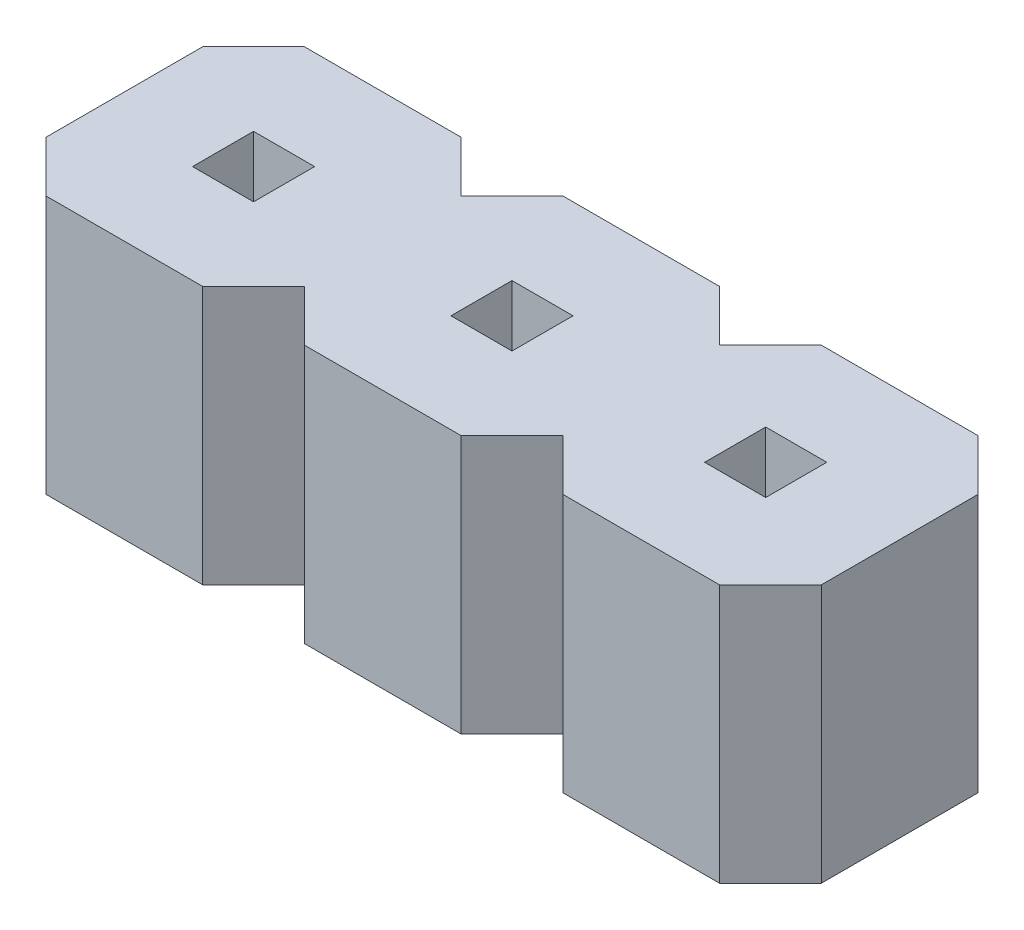
ISO-10303-21;
HEADER;
FILE_DESCRIPTION(('STEP AP214'),'2;1');
FILE_NAME('part.step','',(''),(''),'','','');
FILE_SCHEMA(('AUTOMOTIVE_DESIGN { 1 0 10303 214 1 1 1 1 }'));
ENDSEC;
DATA;
#1=APPLICATION_CONTEXT('core data for automotive mechanical design processes');
#2=APPLICATION_PROTOCOL_DEFINITION('international standard','automotive_design',2000,#1);
#3=PRODUCT_CONTEXT('',#1,'mechanical');
#4=PRODUCT('Part','Part','',(#3));
#5=PRODUCT_RELATED_PRODUCT_CATEGORY('part','',(#4));
#6=PRODUCT_DEFINITION_FORMATION('','',#4);
#7=PRODUCT_DEFINITION_CONTEXT('part definition',#1,'design');
#8=PRODUCT_DEFINITION('design','',#6,#7);
#9=PRODUCT_DEFINITION_SHAPE('','',#8);
#10=(LENGTH_UNIT() NAMED_UNIT(*) SI_UNIT(.MILLI.,.METRE.));
#11=(NAMED_UNIT(*) PLANE_ANGLE_UNIT() SI_UNIT($,.RADIAN.));
#12=(NAMED_UNIT(*) SI_UNIT($,.STERADIAN.) SOLID_ANGLE_UNIT());
#13=UNCERTAINTY_MEASURE_WITH_UNIT(LENGTH_MEASURE(1.E-05),#10,'distance_accuracy_value','');
#14=(GEOMETRIC_REPRESENTATION_CONTEXT(3) GLOBAL_UNCERTAINTY_ASSIGNED_CONTEXT((#13)) GLOBAL_UNIT_ASSIGNED_CONTEXT((#10,
#11,#12)) REPRESENTATION_CONTEXT('',''));
#15=CARTESIAN_POINT('',(0.,0.,0.));
#16=DIRECTION('',(0.,0.,1.));
#17=DIRECTION('',(1.,0.,0.));
#18=AXIS2_PLACEMENT_3D('',#15,#16,#17);
#19=CARTESIAN_POINT('',(0.,2.54,0.));
#20=DIRECTION('',(0.,-1.,0.));
#21=DIRECTION('',(0.,0.,-1.));
#22=AXIS2_PLACEMENT_3D('',#19,#20,#21);
#23=PLANE('',#22);
#24=DIRECTION('',(0.,0.,-1.));
#25=VECTOR('',#24,1.);
#26=CARTESIAN_POINT('',(-0.97,2.54,-0.97));
#27=LINE('',#26,#25);
#28=CARTESIAN_POINT('',(-0.97,2.54,-0.97));
#29=VERTEX_POINT('',#28);
#30=CARTESIAN_POINT('',(-0.97,2.54,-1.57));
#31=VERTEX_POINT('',#30);
#32=EDGE_CURVE('E280',#29,#31,#27,.T.);
#33=ORIENTED_EDGE('',*,*,#32,.F.);
#34=DIRECTION('',(1.,0.,0.));
#35=VECTOR('',#34,1.);
#36=CARTESIAN_POINT('',(-1.57,2.54,-0.97));
#37=LINE('',#36,#35);
#38=CARTESIAN_POINT('',(-1.57,2.54,-0.97));
#39=VERTEX_POINT('',#38);
#40=EDGE_CURVE('E288',#39,#29,#37,.T.);
#41=ORIENTED_EDGE('',*,*,#40,.F.);
#42=DIRECTION('',(0.,0.,1.));
#43=VECTOR('',#42,1.);
#44=CARTESIAN_POINT('',(-1.57,2.54,-0.97));
#45=LINE('',#44,#43);
#46=CARTESIAN_POINT('',(-1.57,2.54,-1.57));
#47=VERTEX_POINT('',#46);
#48=EDGE_CURVE('E285',#47,#39,#45,.T.);
#49=ORIENTED_EDGE('',*,*,#48,.F.);
#50=DIRECTION('',(-1.,0.,0.));
#51=VECTOR('',#50,1.);
#52=CARTESIAN_POINT('',(-1.57,2.54,-1.57));
#53=LINE('',#52,#51);
#54=EDGE_CURVE('E282',#31,#47,#53,.T.);
#55=ORIENTED_EDGE('',*,*,#54,.F.);
#56=EDGE_LOOP('',(#33,#41,#49,#55));
#57=FACE_BOUND('',#56,.T.);
#58=DIRECTION('',(-1.,0.,0.));
#59=VECTOR('',#58,1.);
#60=CARTESIAN_POINT('',(-3.04,2.54,-2.54));
#61=LINE('',#60,#59);
#62=CARTESIAN_POINT('',(-3.04,2.54,-2.54));
#63=VERTEX_POINT('',#62);
#64=CARTESIAN_POINT('',(-4.58,2.54,-2.54));
#65=VERTEX_POINT('',#64);
#66=EDGE_CURVE('E342',#63,#65,#61,.T.);
#67=ORIENTED_EDGE('',*,*,#66,.T.);
#68=DIRECTION('',(-0.707106781186548,0.,0.707106781186548));
#69=VECTOR('',#68,1.);
#70=CARTESIAN_POINT('',(-4.58,2.54,-2.54));
#71=LINE('',#70,#69);
#72=CARTESIAN_POINT('',(-5.08,2.54,-2.04));
#73=VERTEX_POINT('',#72);
#74=EDGE_CURVE('E345',#65,#73,#71,.T.);
#75=ORIENTED_EDGE('',*,*,#74,.T.);
#76=DIRECTION('',(0.,0.,1.));
#77=VECTOR('',#76,1.);
#78=CARTESIAN_POINT('',(-5.08,2.54,-0.499999999999999));
#79=LINE('',#78,#77);
#80=CARTESIAN_POINT('',(-5.08,2.54,-0.499999999999999));
#81=VERTEX_POINT('',#80);
#82=EDGE_CURVE('E348',#73,#81,#79,.T.);
#83=ORIENTED_EDGE('',*,*,#82,.T.);
#84=DIRECTION('',(0.707106781186547,0.,0.707106781186548));
#85=VECTOR('',#84,1.);
#86=CARTESIAN_POINT('',(-4.58,2.54,0.));
#87=LINE('',#86,#85);
#88=CARTESIAN_POINT('',(-4.58,2.54,0.));
#89=VERTEX_POINT('',#88);
#90=EDGE_CURVE('E350',#81,#89,#87,.T.);
#91=ORIENTED_EDGE('',*,*,#90,.T.);
#92=DIRECTION('',(1.,0.,0.));
#93=VECTOR('',#92,1.);
#94=CARTESIAN_POINT('',(-3.04,2.54,0.));
#95=LINE('',#94,#93);
#96=CARTESIAN_POINT('',(-3.04,2.54,0.));
#97=VERTEX_POINT('',#96);
#98=EDGE_CURVE('E352',#89,#97,#95,.T.);
#99=ORIENTED_EDGE('',*,*,#98,.T.);
#100=DIRECTION('',(0.707106781186548,0.,-0.707106781186547));
#101=VECTOR('',#100,1.);
#102=CARTESIAN_POINT('',(-3.04,2.54,0.));
#103=LINE('',#102,#101);
#104=CARTESIAN_POINT('',(-2.54,2.54,-0.499999999999999));
#105=VERTEX_POINT('',#104);
#106=EDGE_CURVE('E354',#97,#105,#103,.T.);
#107=ORIENTED_EDGE('',*,*,#106,.T.);
#108=DIRECTION('',(0.707106781186548,0.,0.707106781186547));
#109=VECTOR('',#108,1.);
#110=CARTESIAN_POINT('',(-2.54,2.54,-0.499999999999999));
#111=LINE('',#110,#109);
#112=CARTESIAN_POINT('',(-2.04,2.54,0.));
#113=VERTEX_POINT('',#112);
#114=EDGE_CURVE('E356',#105,#113,#111,.T.);
#115=ORIENTED_EDGE('',*,*,#114,.T.);
#116=DIRECTION('',(1.,0.,0.));
#117=VECTOR('',#116,1.);
#118=CARTESIAN_POINT('',(-0.5,2.54,0.));
#119=LINE('',#118,#117);
#120=CARTESIAN_POINT('',(-0.5,2.54,0.));
#121=VERTEX_POINT('',#120);
#122=EDGE_CURVE('E358',#113,#121,#119,.T.);
#123=ORIENTED_EDGE('',*,*,#122,.T.);
#124=DIRECTION('',(0.707106781186547,0.,-0.707106781186548));
#125=VECTOR('',#124,1.);
#126=CARTESIAN_POINT('',(0.,2.54,-0.5));
#127=LINE('',#126,#125);
#128=CARTESIAN_POINT('',(0.,2.54,-0.5));
#129=VERTEX_POINT('',#128);
#130=EDGE_CURVE('E360',#121,#129,#127,.T.);
#131=ORIENTED_EDGE('',*,*,#130,.T.);
#132=DIRECTION('',(0.707106781186546,0.,0.707106781186549));
#133=VECTOR('',#132,1.);
#134=CARTESIAN_POINT('',(0.499999999999998,2.54,0.));
#135=LINE('',#134,#133);
#136=CARTESIAN_POINT('',(0.499999999999998,2.54,0.));
#137=VERTEX_POINT('',#136);
#138=EDGE_CURVE('E362',#129,#137,#135,.T.);
#139=ORIENTED_EDGE('',*,*,#138,.T.);
#140=DIRECTION('',(1.,0.,0.));
#141=VECTOR('',#140,1.);
#142=CARTESIAN_POINT('',(2.04,2.54,0.));
#143=LINE('',#142,#141);
#144=CARTESIAN_POINT('',(2.04,2.54,0.));
#145=VERTEX_POINT('',#144);
#146=EDGE_CURVE('E364',#137,#145,#143,.T.);
#147=ORIENTED_EDGE('',*,*,#146,.T.);
#148=DIRECTION('',(0.707106781186548,0.,-0.707106781186547));
#149=VECTOR('',#148,1.);
#150=CARTESIAN_POINT('',(2.54,2.54,-0.499999999999999));
#151=LINE('',#150,#149);
#152=CARTESIAN_POINT('',(2.54,2.54,-0.499999999999999));
#153=VERTEX_POINT('',#152);
#154=EDGE_CURVE('E366',#145,#153,#151,.T.);
#155=ORIENTED_EDGE('',*,*,#154,.T.);
#156=DIRECTION('',(0.,0.,-1.));
#157=VECTOR('',#156,1.);
#158=CARTESIAN_POINT('',(2.54,2.54,-2.03999999999999));
#159=LINE('',#158,#157);
#160=CARTESIAN_POINT('',(2.54,2.54,-2.03999999999999));
#161=VERTEX_POINT('',#160);
#162=EDGE_CURVE('E368',#153,#161,#159,.T.);
#163=ORIENTED_EDGE('',*,*,#162,.T.);
#164=DIRECTION('',(-0.707106781186546,0.,-0.707106781186549));
#165=VECTOR('',#164,1.);
#166=CARTESIAN_POINT('',(2.04,2.54,-2.54));
#167=LINE('',#166,#165);
#168=CARTESIAN_POINT('',(2.04,2.54,-2.54));
#169=VERTEX_POINT('',#168);
#170=EDGE_CURVE('E370',#161,#169,#167,.T.);
#171=ORIENTED_EDGE('',*,*,#170,.T.);
#172=DIRECTION('',(-1.,0.,0.));
#173=VECTOR('',#172,1.);
#174=CARTESIAN_POINT('',(0.5,2.54,-2.54));
#175=LINE('',#174,#173);
#176=CARTESIAN_POINT('',(0.5,2.54,-2.54));
#177=VERTEX_POINT('',#176);
#178=EDGE_CURVE('E372',#169,#177,#175,.T.);
#179=ORIENTED_EDGE('',*,*,#178,.T.);
#180=DIRECTION('',(-0.707106781186549,0.,0.707106781186546));
#181=VECTOR('',#180,1.);
#182=CARTESIAN_POINT('',(0.,2.54,-2.04));
#183=LINE('',#182,#181);
#184=CARTESIAN_POINT('',(0.,2.54,-2.04));
#185=VERTEX_POINT('',#184);
#186=EDGE_CURVE('E374',#177,#185,#183,.T.);
#187=ORIENTED_EDGE('',*,*,#186,.T.);
#188=DIRECTION('',(-0.707106781186548,0.,-0.707106781186548));
#189=VECTOR('',#188,1.);
#190=CARTESIAN_POINT('',(0.,2.54,-2.04));
#191=LINE('',#190,#189);
#192=CARTESIAN_POINT('',(-0.5,2.54,-2.54));
#193=VERTEX_POINT('',#192);
#194=EDGE_CURVE('E376',#185,#193,#191,.T.);
#195=ORIENTED_EDGE('',*,*,#194,.T.);
#196=DIRECTION('',(-1.,0.,0.));
#197=VECTOR('',#196,1.);
#198=CARTESIAN_POINT('',(-0.5,2.54,-2.54));
#199=LINE('',#198,#197);
#200=CARTESIAN_POINT('',(-2.04,2.54,-2.54));
#201=VERTEX_POINT('',#200);
#202=EDGE_CURVE('E378',#193,#201,#199,.T.);
#203=ORIENTED_EDGE('',*,*,#202,.T.);
#204=DIRECTION('',(-0.707106781186548,0.,0.707106781186548));
#205=VECTOR('',#204,1.);
#206=CARTESIAN_POINT('',(-2.54,2.54,-2.04));
#207=LINE('',#206,#205);
#208=CARTESIAN_POINT('',(-2.54,2.54,-2.04));
#209=VERTEX_POINT('',#208);
#210=EDGE_CURVE('E380',#201,#209,#207,.T.);
#211=ORIENTED_EDGE('',*,*,#210,.T.);
#212=DIRECTION('',(-0.707106781186548,0.,-0.707106781186547));
#213=VECTOR('',#212,1.);
#214=CARTESIAN_POINT('',(-3.04,2.54,-2.54));
#215=LINE('',#214,#213);
#216=EDGE_CURVE('E382',#209,#63,#215,.T.);
#217=ORIENTED_EDGE('',*,*,#216,.T.);
#218=EDGE_LOOP('',(#67,#75,#83,#91,#99,#107,#115,#123,#131,#139,#147,#155,#163,#171,#179,#187,
#195,#203,#211,#217));
#219=FACE_BOUND('',#218,.T.);
#220=DIRECTION('',(0.,0.,-1.));
#221=VECTOR('',#220,1.);
#222=CARTESIAN_POINT('',(-3.51,2.54,-0.97));
#223=LINE('',#222,#221);
#224=CARTESIAN_POINT('',(-3.51,2.54,-0.97));
#225=VERTEX_POINT('',#224);
#226=CARTESIAN_POINT('',(-3.51,2.54,-1.57));
#227=VERTEX_POINT('',#226);
#228=EDGE_CURVE('E311',#225,#227,#223,.T.);
#229=ORIENTED_EDGE('',*,*,#228,.F.);
#230=DIRECTION('',(1.,0.,0.));
#231=VECTOR('',#230,1.);
#232=CARTESIAN_POINT('',(-4.11,2.54,-0.97));
#233=LINE('',#232,#231);
#234=CARTESIAN_POINT('',(-4.11,2.54,-0.97));
#235=VERTEX_POINT('',#234);
#236=EDGE_CURVE('E319',#235,#225,#233,.T.);
#237=ORIENTED_EDGE('',*,*,#236,.F.);
#238=DIRECTION('',(0.,0.,1.));
#239=VECTOR('',#238,1.);
#240=CARTESIAN_POINT('',(-4.11,2.54,-0.97));
#241=LINE('',#240,#239);
#242=CARTESIAN_POINT('',(-4.11,2.54,-1.57));
#243=VERTEX_POINT('',#242);
#244=EDGE_CURVE('E316',#243,#235,#241,.T.);
#245=ORIENTED_EDGE('',*,*,#244,.F.);
#246=DIRECTION('',(-1.,0.,0.));
#247=VECTOR('',#246,1.);
#248=CARTESIAN_POINT('',(-4.11,2.54,-1.57));
#249=LINE('',#248,#247);
#250=EDGE_CURVE('E313',#227,#243,#249,.T.);
#251=ORIENTED_EDGE('',*,*,#250,.F.);
#252=EDGE_LOOP('',(#229,#237,#245,#251));
#253=FACE_BOUND('',#252,.T.);
#254=DIRECTION('',(0.,0.,-1.));
#255=VECTOR('',#254,1.);
#256=CARTESIAN_POINT('',(1.52357369090745,2.54,-0.97));
#257=LINE('',#256,#255);
#258=CARTESIAN_POINT('',(1.52357369090745,2.54,-0.97));
#259=VERTEX_POINT('',#258);
#260=CARTESIAN_POINT('',(1.52357369090745,2.54,-1.57));
#261=VERTEX_POINT('',#260);
#262=EDGE_CURVE('E244',#259,#261,#257,.T.);
#263=ORIENTED_EDGE('',*,*,#262,.F.);
#264=DIRECTION('',(1.,0.,0.));
#265=VECTOR('',#264,1.);
#266=CARTESIAN_POINT('',(0.923573690907446,2.54,-0.97));
#267=LINE('',#266,#265);
#268=CARTESIAN_POINT('',(0.923573690907446,2.54,-0.97));
#269=VERTEX_POINT('',#268);
#270=EDGE_CURVE('E266',#269,#259,#267,.T.);
#271=ORIENTED_EDGE('',*,*,#270,.F.);
#272=DIRECTION('',(0.,0.,1.));
#273=VECTOR('',#272,1.);
#274=CARTESIAN_POINT('',(0.923573690907446,2.54,-0.97));
#275=LINE('',#274,#273);
#276=CARTESIAN_POINT('',(0.923573690907446,2.54,-1.57));
#277=VERTEX_POINT('',#276);
#278=EDGE_CURVE('E264',#277,#269,#275,.T.);
#279=ORIENTED_EDGE('',*,*,#278,.F.);
#280=DIRECTION('',(-1.,0.,0.));
#281=VECTOR('',#280,1.);
#282=CARTESIAN_POINT('',(0.923573690907446,2.54,-1.57));
#283=LINE('',#282,#281);
#284=EDGE_CURVE('E252',#261,#277,#283,.T.);
#285=ORIENTED_EDGE('',*,*,#284,.F.);
#286=EDGE_LOOP('',(#263,#271,#279,#285));
#287=FACE_BOUND('',#286,.T.);
#288=ADVANCED_FACE('F35',(#57,#219,#253,#287),#23,.F.);
#289=CARTESIAN_POINT('',(0.,0.,0.));
#290=DIRECTION('',(0.,-1.,0.));
#291=DIRECTION('',(0.,0.,-1.));
#292=AXIS2_PLACEMENT_3D('',#289,#290,#291);
#293=PLANE('',#292);
#294=DIRECTION('',(-1.,0.,0.));
#295=VECTOR('',#294,1.);
#296=CARTESIAN_POINT('',(-3.04,0.,-2.54));
#297=LINE('',#296,#295);
#298=CARTESIAN_POINT('',(-3.04,0.,-2.54));
#299=VERTEX_POINT('',#298);
#300=CARTESIAN_POINT('',(-4.58,0.,-2.54));
#301=VERTEX_POINT('',#300);
#302=EDGE_CURVE('E341',#299,#301,#297,.T.);
#303=ORIENTED_EDGE('',*,*,#302,.F.);
#304=DIRECTION('',(-0.707106781186548,0.,-0.707106781186547));
#305=VECTOR('',#304,1.);
#306=CARTESIAN_POINT('',(-3.04,0.,-2.54));
#307=LINE('',#306,#305);
#308=CARTESIAN_POINT('',(-2.54,0.,-2.04));
#309=VERTEX_POINT('',#308);
#310=EDGE_CURVE('E346',#309,#299,#307,.T.);
#311=ORIENTED_EDGE('',*,*,#310,.F.);
#312=DIRECTION('',(-0.707106781186548,0.,0.707106781186548));
#313=VECTOR('',#312,1.);
#314=CARTESIAN_POINT('',(-2.54,0.,-2.04));
#315=LINE('',#314,#313);
#316=CARTESIAN_POINT('',(-2.04,0.,-2.54));
#317=VERTEX_POINT('',#316);
#318=EDGE_CURVE('E421',#317,#309,#315,.T.);
#319=ORIENTED_EDGE('',*,*,#318,.F.);
#320=DIRECTION('',(-1.,0.,0.));
#321=VECTOR('',#320,1.);
#322=CARTESIAN_POINT('',(-0.5,0.,-2.54));
#323=LINE('',#322,#321);
#324=CARTESIAN_POINT('',(-0.5,0.,-2.54));
#325=VERTEX_POINT('',#324);
#326=EDGE_CURVE('E419',#325,#317,#323,.T.);
#327=ORIENTED_EDGE('',*,*,#326,.F.);
#328=DIRECTION('',(-0.707106781186548,0.,-0.707106781186548));
#329=VECTOR('',#328,1.);
#330=CARTESIAN_POINT('',(0.,0.,-2.04));
#331=LINE('',#330,#329);
#332=CARTESIAN_POINT('',(0.,0.,-2.04));
#333=VERTEX_POINT('',#332);
#334=EDGE_CURVE('E417',#333,#325,#331,.T.);
#335=ORIENTED_EDGE('',*,*,#334,.F.);
#336=DIRECTION('',(-0.707106781186549,0.,0.707106781186546));
#337=VECTOR('',#336,1.);
#338=CARTESIAN_POINT('',(0.,0.,-2.04));
#339=LINE('',#338,#337);
#340=CARTESIAN_POINT('',(0.5,0.,-2.54));
#341=VERTEX_POINT('',#340);
#342=EDGE_CURVE('E415',#341,#333,#339,.T.);
#343=ORIENTED_EDGE('',*,*,#342,.F.);
#344=DIRECTION('',(-1.,0.,0.));
#345=VECTOR('',#344,1.);
#346=CARTESIAN_POINT('',(0.5,0.,-2.54));
#347=LINE('',#346,#345);
#348=CARTESIAN_POINT('',(2.04,0.,-2.54));
#349=VERTEX_POINT('',#348);
#350=EDGE_CURVE('E413',#349,#341,#347,.T.);
#351=ORIENTED_EDGE('',*,*,#350,.F.);
#352=DIRECTION('',(-0.707106781186546,0.,-0.707106781186549));
#353=VECTOR('',#352,1.);
#354=CARTESIAN_POINT('',(2.04,0.,-2.54));
#355=LINE('',#354,#353);
#356=CARTESIAN_POINT('',(2.54,0.,-2.03999999999999));
#357=VERTEX_POINT('',#356);
#358=EDGE_CURVE('E411',#357,#349,#355,.T.);
#359=ORIENTED_EDGE('',*,*,#358,.F.);
#360=DIRECTION('',(0.,0.,-1.));
#361=VECTOR('',#360,1.);
#362=CARTESIAN_POINT('',(2.54,0.,-2.03999999999999));
#363=LINE('',#362,#361);
#364=CARTESIAN_POINT('',(2.54,0.,-0.499999999999999));
#365=VERTEX_POINT('',#364);
#366=EDGE_CURVE('E409',#365,#357,#363,.T.);
#367=ORIENTED_EDGE('',*,*,#366,.F.);
#368=DIRECTION('',(0.707106781186548,0.,-0.707106781186547));
#369=VECTOR('',#368,1.);
#370=CARTESIAN_POINT('',(2.54,0.,-0.499999999999999));
#371=LINE('',#370,#369);
#372=CARTESIAN_POINT('',(2.04,0.,0.));
#373=VERTEX_POINT('',#372);
#374=EDGE_CURVE('E407',#373,#365,#371,.T.);
#375=ORIENTED_EDGE('',*,*,#374,.F.);
#376=DIRECTION('',(1.,0.,0.));
#377=VECTOR('',#376,1.);
#378=CARTESIAN_POINT('',(2.04,0.,0.));
#379=LINE('',#378,#377);
#380=CARTESIAN_POINT('',(0.499999999999998,0.,0.));
#381=VERTEX_POINT('',#380);
#382=EDGE_CURVE('E405',#381,#373,#379,.T.);
#383=ORIENTED_EDGE('',*,*,#382,.F.);
#384=DIRECTION('',(0.707106781186546,0.,0.707106781186549));
#385=VECTOR('',#384,1.);
#386=CARTESIAN_POINT('',(0.499999999999998,0.,0.));
#387=LINE('',#386,#385);
#388=CARTESIAN_POINT('',(0.,0.,-0.5));
#389=VERTEX_POINT('',#388);
#390=EDGE_CURVE('E403',#389,#381,#387,.T.);
#391=ORIENTED_EDGE('',*,*,#390,.F.);
#392=DIRECTION('',(0.707106781186547,0.,-0.707106781186548));
#393=VECTOR('',#392,1.);
#394=CARTESIAN_POINT('',(0.,0.,-0.5));
#395=LINE('',#394,#393);
#396=CARTESIAN_POINT('',(-0.5,0.,0.));
#397=VERTEX_POINT('',#396);
#398=EDGE_CURVE('E401',#397,#389,#395,.T.);
#399=ORIENTED_EDGE('',*,*,#398,.F.);
#400=DIRECTION('',(1.,0.,0.));
#401=VECTOR('',#400,1.);
#402=CARTESIAN_POINT('',(-0.5,0.,0.));
#403=LINE('',#402,#401);
#404=CARTESIAN_POINT('',(-2.04,0.,0.));
#405=VERTEX_POINT('',#404);
#406=EDGE_CURVE('E399',#405,#397,#403,.T.);
#407=ORIENTED_EDGE('',*,*,#406,.F.);
#408=DIRECTION('',(0.707106781186548,0.,0.707106781186547));
#409=VECTOR('',#408,1.);
#410=CARTESIAN_POINT('',(-2.54,0.,-0.499999999999999));
#411=LINE('',#410,#409);
#412=CARTESIAN_POINT('',(-2.54,0.,-0.499999999999999));
#413=VERTEX_POINT('',#412);
#414=EDGE_CURVE('E397',#413,#405,#411,.T.);
#415=ORIENTED_EDGE('',*,*,#414,.F.);
#416=DIRECTION('',(0.707106781186548,0.,-0.707106781186547));
#417=VECTOR('',#416,1.);
#418=CARTESIAN_POINT('',(-3.04,0.,0.));
#419=LINE('',#418,#417);
#420=CARTESIAN_POINT('',(-3.04,0.,0.));
#421=VERTEX_POINT('',#420);
#422=EDGE_CURVE('E395',#421,#413,#419,.T.);
#423=ORIENTED_EDGE('',*,*,#422,.F.);
#424=DIRECTION('',(1.,0.,0.));
#425=VECTOR('',#424,1.);
#426=CARTESIAN_POINT('',(-3.04,0.,0.));
#427=LINE('',#426,#425);
#428=CARTESIAN_POINT('',(-4.58,0.,0.));
#429=VERTEX_POINT('',#428);
#430=EDGE_CURVE('E393',#429,#421,#427,.T.);
#431=ORIENTED_EDGE('',*,*,#430,.F.);
#432=DIRECTION('',(0.707106781186547,0.,0.707106781186548));
#433=VECTOR('',#432,1.);
#434=CARTESIAN_POINT('',(-4.58,0.,0.));
#435=LINE('',#434,#433);
#436=CARTESIAN_POINT('',(-5.08,0.,-0.499999999999999));
#437=VERTEX_POINT('',#436);
#438=EDGE_CURVE('E391',#437,#429,#435,.T.);
#439=ORIENTED_EDGE('',*,*,#438,.F.);
#440=DIRECTION('',(0.,0.,1.));
#441=VECTOR('',#440,1.);
#442=CARTESIAN_POINT('',(-5.08,0.,-0.499999999999999));
#443=LINE('',#442,#441);
#444=CARTESIAN_POINT('',(-5.08,0.,-2.04));
#445=VERTEX_POINT('',#444);
#446=EDGE_CURVE('E389',#445,#437,#443,.T.);
#447=ORIENTED_EDGE('',*,*,#446,.F.);
#448=DIRECTION('',(-0.707106781186548,0.,0.707106781186548));
#449=VECTOR('',#448,1.);
#450=CARTESIAN_POINT('',(-4.58,0.,-2.54));
#451=LINE('',#450,#449);
#452=EDGE_CURVE('E387',#301,#445,#451,.T.);
#453=ORIENTED_EDGE('',*,*,#452,.F.);
#454=EDGE_LOOP('',(#303,#311,#319,#327,#335,#343,#351,#359,#367,#375,#383,#391,#399,#407,#415,
#423,#431,#439,#447,#453));
#455=FACE_BOUND('',#454,.T.);
#456=DIRECTION('',(1.,0.,0.));
#457=VECTOR('',#456,1.);
#458=CARTESIAN_POINT('',(-4.11,0.,-0.97));
#459=LINE('',#458,#457);
#460=CARTESIAN_POINT('',(-4.11,0.,-0.97));
#461=VERTEX_POINT('',#460);
#462=CARTESIAN_POINT('',(-3.51,0.,-0.97));
#463=VERTEX_POINT('',#462);
#464=EDGE_CURVE('E314',#461,#463,#459,.T.);
#465=ORIENTED_EDGE('',*,*,#464,.T.);
#466=DIRECTION('',(0.,0.,-1.));
#467=VECTOR('',#466,1.);
#468=CARTESIAN_POINT('',(-3.51,0.,-0.97));
#469=LINE('',#468,#467);
#470=CARTESIAN_POINT('',(-3.51,0.,-1.57));
#471=VERTEX_POINT('',#470);
#472=EDGE_CURVE('E310',#463,#471,#469,.T.);
#473=ORIENTED_EDGE('',*,*,#472,.T.);
#474=DIRECTION('',(-1.,0.,0.));
#475=VECTOR('',#474,1.);
#476=CARTESIAN_POINT('',(-4.11,0.,-1.57));
#477=LINE('',#476,#475);
#478=CARTESIAN_POINT('',(-4.11,0.,-1.57));
#479=VERTEX_POINT('',#478);
#480=EDGE_CURVE('E324',#471,#479,#477,.T.);
#481=ORIENTED_EDGE('',*,*,#480,.T.);
#482=DIRECTION('',(0.,0.,1.));
#483=VECTOR('',#482,1.);
#484=CARTESIAN_POINT('',(-4.11,0.,-0.97));
#485=LINE('',#484,#483);
#486=EDGE_CURVE('E327',#479,#461,#485,.T.);
#487=ORIENTED_EDGE('',*,*,#486,.T.);
#488=EDGE_LOOP('',(#465,#473,#481,#487));
#489=FACE_BOUND('',#488,.T.);
#490=DIRECTION('',(1.,0.,0.));
#491=VECTOR('',#490,1.);
#492=CARTESIAN_POINT('',(-1.57,0.,-0.97));
#493=LINE('',#492,#491);
#494=CARTESIAN_POINT('',(-1.57,0.,-0.97));
#495=VERTEX_POINT('',#494);
#496=CARTESIAN_POINT('',(-0.97,0.,-0.97));
#497=VERTEX_POINT('',#496);
#498=EDGE_CURVE('E283',#495,#497,#493,.T.);
#499=ORIENTED_EDGE('',*,*,#498,.T.);
#500=DIRECTION('',(0.,0.,-1.));
#501=VECTOR('',#500,1.);
#502=CARTESIAN_POINT('',(-0.97,0.,-0.97));
#503=LINE('',#502,#501);
#504=CARTESIAN_POINT('',(-0.97,0.,-1.57));
#505=VERTEX_POINT('',#504);
#506=EDGE_CURVE('E260',#497,#505,#503,.T.);
#507=ORIENTED_EDGE('',*,*,#506,.T.);
#508=DIRECTION('',(-1.,0.,0.));
#509=VECTOR('',#508,1.);
#510=CARTESIAN_POINT('',(-1.57,0.,-1.57));
#511=LINE('',#510,#509);
#512=CARTESIAN_POINT('',(-1.57,0.,-1.57));
#513=VERTEX_POINT('',#512);
#514=EDGE_CURVE('E293',#505,#513,#511,.T.);
#515=ORIENTED_EDGE('',*,*,#514,.T.);
#516=DIRECTION('',(0.,0.,1.));
#517=VECTOR('',#516,1.);
#518=CARTESIAN_POINT('',(-1.57,0.,-0.97));
#519=LINE('',#518,#517);
#520=EDGE_CURVE('E296',#513,#495,#519,.T.);
#521=ORIENTED_EDGE('',*,*,#520,.T.);
#522=EDGE_LOOP('',(#499,#507,#515,#521));
#523=FACE_BOUND('',#522,.T.);
#524=DIRECTION('',(1.,0.,0.));
#525=VECTOR('',#524,1.);
#526=CARTESIAN_POINT('',(0.923573690907446,0.,-0.97));
#527=LINE('',#526,#525);
#528=CARTESIAN_POINT('',(0.923573690907446,0.,-0.97));
#529=VERTEX_POINT('',#528);
#530=CARTESIAN_POINT('',(1.52357369090745,0.,-0.97));
#531=VERTEX_POINT('',#530);
#532=EDGE_CURVE('E253',#529,#531,#527,.T.);
#533=ORIENTED_EDGE('',*,*,#532,.T.);
#534=DIRECTION('',(0.,0.,-1.));
#535=VECTOR('',#534,1.);
#536=CARTESIAN_POINT('',(1.52357369090745,0.,-0.97));
#537=LINE('',#536,#535);
#538=CARTESIAN_POINT('',(1.52357369090745,0.,-1.57));
#539=VERTEX_POINT('',#538);
#540=EDGE_CURVE('E58',#531,#539,#537,.T.);
#541=ORIENTED_EDGE('',*,*,#540,.T.);
#542=DIRECTION('',(-1.,0.,0.));
#543=VECTOR('',#542,1.);
#544=CARTESIAN_POINT('',(0.923573690907446,0.,-1.57));
#545=LINE('',#544,#543);
#546=CARTESIAN_POINT('',(0.923573690907446,0.,-1.57));
#547=VERTEX_POINT('',#546);
#548=EDGE_CURVE('E259',#539,#547,#545,.T.);
#549=ORIENTED_EDGE('',*,*,#548,.T.);
#550=DIRECTION('',(0.,0.,1.));
#551=VECTOR('',#550,1.);
#552=CARTESIAN_POINT('',(0.923573690907446,0.,-0.97));
#553=LINE('',#552,#551);
#554=EDGE_CURVE('E272',#547,#529,#553,.T.);
#555=ORIENTED_EDGE('',*,*,#554,.T.);
#556=EDGE_LOOP('',(#533,#541,#549,#555));
#557=FACE_BOUND('',#556,.T.);
#558=ADVANCED_FACE('F487',(#455,#489,#523,#557),#293,.T.);
#559=CARTESIAN_POINT('',(-3.04,2.54,-2.54));
#560=DIRECTION('',(0.,0.,1.));
#561=DIRECTION('',(1.,0.,0.));
#562=AXIS2_PLACEMENT_3D('',#559,#560,#561);
#563=PLANE('',#562);
#564=ORIENTED_EDGE('',*,*,#302,.T.);
#565=DIRECTION('',(0.,-1.,0.));
#566=VECTOR('',#565,1.);
#567=CARTESIAN_POINT('',(-4.58,2.54,-2.54));
#568=LINE('',#567,#566);
#569=EDGE_CURVE('E11',#65,#301,#568,.T.);
#570=ORIENTED_EDGE('',*,*,#569,.F.);
#571=ORIENTED_EDGE('',*,*,#66,.F.);
#572=DIRECTION('',(0.,-1.,0.));
#573=VECTOR('',#572,1.);
#574=CARTESIAN_POINT('',(-3.04,2.54,-2.54));
#575=LINE('',#574,#573);
#576=EDGE_CURVE('E384',#63,#299,#575,.T.);
#577=ORIENTED_EDGE('',*,*,#576,.T.);
#578=EDGE_LOOP('',(#564,#570,#571,#577));
#579=FACE_BOUND('',#578,.T.);
#580=ADVANCED_FACE('F37',(#579),#563,.F.);
#581=CARTESIAN_POINT('',(-4.58,2.54,-2.54));
#582=DIRECTION('',(0.707106781186548,0.,0.707106781186548));
#583=DIRECTION('',(0.707106781186548,0.,-0.707106781186548));
#584=AXIS2_PLACEMENT_3D('',#581,#582,#583);
#585=PLANE('',#584);
#586=ORIENTED_EDGE('',*,*,#452,.T.);
#587=DIRECTION('',(0.,-1.,0.));
#588=VECTOR('',#587,1.);
#589=CARTESIAN_POINT('',(-5.08,2.54,-2.04));
#590=LINE('',#589,#588);
#591=EDGE_CURVE('E43',#73,#445,#590,.T.);
#592=ORIENTED_EDGE('',*,*,#591,.F.);
#593=ORIENTED_EDGE('',*,*,#74,.F.);
#594=ORIENTED_EDGE('',*,*,#569,.T.);
#595=EDGE_LOOP('',(#586,#592,#593,#594));
#596=FACE_BOUND('',#595,.T.);
#597=ADVANCED_FACE('F505',(#596),#585,.F.);
#598=CARTESIAN_POINT('',(-5.08,2.54,-0.499999999999999));
#599=DIRECTION('',(1.,0.,0.));
#600=DIRECTION('',(0.,0.,-1.));
#601=AXIS2_PLACEMENT_3D('',#598,#599,#600);
#602=PLANE('',#601);
#603=ORIENTED_EDGE('',*,*,#446,.T.);
#604=DIRECTION('',(0.,-1.,0.));
#605=VECTOR('',#604,1.);
#606=CARTESIAN_POINT('',(-5.08,2.54,-0.499999999999999));
#607=LINE('',#606,#605);
#608=EDGE_CURVE('E474',#81,#437,#607,.T.);
#609=ORIENTED_EDGE('',*,*,#608,.F.);
#610=ORIENTED_EDGE('',*,*,#82,.F.);
#611=ORIENTED_EDGE('',*,*,#591,.T.);
#612=EDGE_LOOP('',(#603,#609,#610,#611));
#613=FACE_BOUND('',#612,.T.);
#614=ADVANCED_FACE('F481',(#613),#602,.F.);
#615=CARTESIAN_POINT('',(-4.58,2.54,0.));
#616=DIRECTION('',(0.707106781186548,0.,-0.707106781186547));
#617=DIRECTION('',(-0.707106781186547,0.,-0.707106781186548));
#618=AXIS2_PLACEMENT_3D('',#615,#616,#617);
#619=PLANE('',#618);
#620=ORIENTED_EDGE('',*,*,#438,.T.);
#621=DIRECTION('',(0.,-1.,0.));
#622=VECTOR('',#621,1.);
#623=CARTESIAN_POINT('',(-4.58,2.54,0.));
#624=LINE('',#623,#622);
#625=EDGE_CURVE('E471',#89,#429,#624,.T.);
#626=ORIENTED_EDGE('',*,*,#625,.F.);
#627=ORIENTED_EDGE('',*,*,#90,.F.);
#628=ORIENTED_EDGE('',*,*,#608,.T.);
#629=EDGE_LOOP('',(#620,#626,#627,#628));
#630=FACE_BOUND('',#629,.T.);
#631=ADVANCED_FACE('F493',(#630),#619,.F.);
#632=CARTESIAN_POINT('',(-3.04,2.54,0.));
#633=DIRECTION('',(0.,0.,-1.));
#634=DIRECTION('',(-1.,0.,0.));
#635=AXIS2_PLACEMENT_3D('',#632,#633,#634);
#636=PLANE('',#635);
#637=ORIENTED_EDGE('',*,*,#430,.T.);
#638=DIRECTION('',(0.,-1.,0.));
#639=VECTOR('',#638,1.);
#640=CARTESIAN_POINT('',(-3.04,2.54,0.));
#641=LINE('',#640,#639);
#642=EDGE_CURVE('E468',#97,#421,#641,.T.);
#643=ORIENTED_EDGE('',*,*,#642,.F.);
#644=ORIENTED_EDGE('',*,*,#98,.F.);
#645=ORIENTED_EDGE('',*,*,#625,.T.);
#646=EDGE_LOOP('',(#637,#643,#644,#645));
#647=FACE_BOUND('',#646,.T.);
#648=ADVANCED_FACE('F497',(#647),#636,.F.);
#649=CARTESIAN_POINT('',(-3.04,2.54,0.));
#650=DIRECTION('',(-0.707106781186547,0.,-0.707106781186548));
#651=DIRECTION('',(-0.707106781186548,0.,0.707106781186547));
#652=AXIS2_PLACEMENT_3D('',#649,#650,#651);
#653=PLANE('',#652);
#654=ORIENTED_EDGE('',*,*,#422,.T.);
#655=DIRECTION('',(0.,-1.,0.));
#656=VECTOR('',#655,1.);
#657=CARTESIAN_POINT('',(-2.54,2.54,-0.499999999999999));
#658=LINE('',#657,#656);
#659=EDGE_CURVE('E465',#105,#413,#658,.T.);
#660=ORIENTED_EDGE('',*,*,#659,.F.);
#661=ORIENTED_EDGE('',*,*,#106,.F.);
#662=ORIENTED_EDGE('',*,*,#642,.T.);
#663=EDGE_LOOP('',(#654,#660,#661,#662));
#664=FACE_BOUND('',#663,.T.);
#665=ADVANCED_FACE('F578',(#664),#653,.F.);
#666=CARTESIAN_POINT('',(-2.54,2.54,-0.499999999999999));
#667=DIRECTION('',(0.707106781186547,0.,-0.707106781186548));
#668=DIRECTION('',(-0.707106781186548,0.,-0.707106781186547));
#669=AXIS2_PLACEMENT_3D('',#666,#667,#668);
#670=PLANE('',#669);
#671=ORIENTED_EDGE('',*,*,#414,.T.);
#672=DIRECTION('',(0.,-1.,0.));
#673=VECTOR('',#672,1.);
#674=CARTESIAN_POINT('',(-2.04,2.54,0.));
#675=LINE('',#674,#673);
#676=EDGE_CURVE('E462',#113,#405,#675,.T.);
#677=ORIENTED_EDGE('',*,*,#676,.F.);
#678=ORIENTED_EDGE('',*,*,#114,.F.);
#679=ORIENTED_EDGE('',*,*,#659,.T.);
#680=EDGE_LOOP('',(#671,#677,#678,#679));
#681=FACE_BOUND('',#680,.T.);
#682=ADVANCED_FACE('F576',(#681),#670,.F.);
#683=CARTESIAN_POINT('',(-0.5,2.54,0.));
#684=DIRECTION('',(0.,0.,-1.));
#685=DIRECTION('',(-1.,0.,0.));
#686=AXIS2_PLACEMENT_3D('',#683,#684,#685);
#687=PLANE('',#686);
#688=ORIENTED_EDGE('',*,*,#406,.T.);
#689=DIRECTION('',(0.,-1.,0.));
#690=VECTOR('',#689,1.);
#691=CARTESIAN_POINT('',(-0.5,2.54,0.));
#692=LINE('',#691,#690);
#693=EDGE_CURVE('E459',#121,#397,#692,.T.);
#694=ORIENTED_EDGE('',*,*,#693,.F.);
#695=ORIENTED_EDGE('',*,*,#122,.F.);
#696=ORIENTED_EDGE('',*,*,#676,.T.);
#697=EDGE_LOOP('',(#688,#694,#695,#696));
#698=FACE_BOUND('',#697,.T.);
#699=ADVANCED_FACE('F571',(#698),#687,.F.);
#700=CARTESIAN_POINT('',(0.,2.54,-0.5));
#701=DIRECTION('',(-0.707106781186548,0.,-0.707106781186547));
#702=DIRECTION('',(-0.707106781186547,0.,0.707106781186548));
#703=AXIS2_PLACEMENT_3D('',#700,#701,#702);
#704=PLANE('',#703);
#705=ORIENTED_EDGE('',*,*,#398,.T.);
#706=DIRECTION('',(0.,-1.,0.));
#707=VECTOR('',#706,1.);
#708=CARTESIAN_POINT('',(0.,2.54,-0.5));
#709=LINE('',#708,#707);
#710=EDGE_CURVE('E456',#129,#389,#709,.T.);
#711=ORIENTED_EDGE('',*,*,#710,.F.);
#712=ORIENTED_EDGE('',*,*,#130,.F.);
#713=ORIENTED_EDGE('',*,*,#693,.T.);
#714=EDGE_LOOP('',(#705,#711,#712,#713));
#715=FACE_BOUND('',#714,.T.);
#716=ADVANCED_FACE('F566',(#715),#704,.F.);
#717=CARTESIAN_POINT('',(0.499999999999998,2.54,0.));
#718=DIRECTION('',(0.707106781186549,0.,-0.707106781186546));
#719=DIRECTION('',(-0.707106781186546,0.,-0.707106781186549));
#720=AXIS2_PLACEMENT_3D('',#717,#718,#719);
#721=PLANE('',#720);
#722=ORIENTED_EDGE('',*,*,#390,.T.);
#723=DIRECTION('',(0.,-1.,0.));
#724=VECTOR('',#723,1.);
#725=CARTESIAN_POINT('',(0.499999999999998,2.54,0.));
#726=LINE('',#725,#724);
#727=EDGE_CURVE('E453',#137,#381,#726,.T.);
#728=ORIENTED_EDGE('',*,*,#727,.F.);
#729=ORIENTED_EDGE('',*,*,#138,.F.);
#730=ORIENTED_EDGE('',*,*,#710,.T.);
#731=EDGE_LOOP('',(#722,#728,#729,#730));
#732=FACE_BOUND('',#731,.T.);
#733=ADVANCED_FACE('F562',(#732),#721,.F.);
#734=CARTESIAN_POINT('',(2.04,2.54,0.));
#735=DIRECTION('',(0.,0.,-1.));
#736=DIRECTION('',(-1.,0.,0.));
#737=AXIS2_PLACEMENT_3D('',#734,#735,#736);
#738=PLANE('',#737);
#739=ORIENTED_EDGE('',*,*,#382,.T.);
#740=DIRECTION('',(0.,-1.,0.));
#741=VECTOR('',#740,1.);
#742=CARTESIAN_POINT('',(2.04,2.54,0.));
#743=LINE('',#742,#741);
#744=EDGE_CURVE('E450',#145,#373,#743,.T.);
#745=ORIENTED_EDGE('',*,*,#744,.F.);
#746=ORIENTED_EDGE('',*,*,#146,.F.);
#747=ORIENTED_EDGE('',*,*,#727,.T.);
#748=EDGE_LOOP('',(#739,#745,#746,#747));
#749=FACE_BOUND('',#748,.T.);
#750=ADVANCED_FACE('F557',(#749),#738,.F.);
#751=CARTESIAN_POINT('',(2.54,2.54,-0.499999999999999));
#752=DIRECTION('',(-0.707106781186547,0.,-0.707106781186548));
#753=DIRECTION('',(-0.707106781186548,0.,0.707106781186547));
#754=AXIS2_PLACEMENT_3D('',#751,#752,#753);
#755=PLANE('',#754);
#756=ORIENTED_EDGE('',*,*,#374,.T.);
#757=DIRECTION('',(0.,-1.,0.));
#758=VECTOR('',#757,1.);
#759=CARTESIAN_POINT('',(2.54,2.54,-0.499999999999999));
#760=LINE('',#759,#758);
#761=EDGE_CURVE('E447',#153,#365,#760,.T.);
#762=ORIENTED_EDGE('',*,*,#761,.F.);
#763=ORIENTED_EDGE('',*,*,#154,.F.);
#764=ORIENTED_EDGE('',*,*,#744,.T.);
#765=EDGE_LOOP('',(#756,#762,#763,#764));
#766=FACE_BOUND('',#765,.T.);
#767=ADVANCED_FACE('F551',(#766),#755,.F.);
#768=CARTESIAN_POINT('',(2.54,2.54,-2.03999999999999));
#769=DIRECTION('',(-1.,0.,0.));
#770=DIRECTION('',(0.,0.,1.));
#771=AXIS2_PLACEMENT_3D('',#768,#769,#770);
#772=PLANE('',#771);
#773=ORIENTED_EDGE('',*,*,#366,.T.);
#774=DIRECTION('',(0.,-1.,0.));
#775=VECTOR('',#774,1.);
#776=CARTESIAN_POINT('',(2.54,2.54,-2.03999999999999));
#777=LINE('',#776,#775);
#778=EDGE_CURVE('E444',#161,#357,#777,.T.);
#779=ORIENTED_EDGE('',*,*,#778,.F.);
#780=ORIENTED_EDGE('',*,*,#162,.F.);
#781=ORIENTED_EDGE('',*,*,#761,.T.);
#782=EDGE_LOOP('',(#773,#779,#780,#781));
#783=FACE_BOUND('',#782,.T.);
#784=ADVANCED_FACE('F547',(#783),#772,.F.);
#785=CARTESIAN_POINT('',(2.04,2.54,-2.54));
#786=DIRECTION('',(-0.707106781186549,0.,0.707106781186546));
#787=DIRECTION('',(0.707106781186546,0.,0.707106781186549));
#788=AXIS2_PLACEMENT_3D('',#785,#786,#787);
#789=PLANE('',#788);
#790=ORIENTED_EDGE('',*,*,#358,.T.);
#791=DIRECTION('',(0.,-1.,0.));
#792=VECTOR('',#791,1.);
#793=CARTESIAN_POINT('',(2.04,2.54,-2.54));
#794=LINE('',#793,#792);
#795=EDGE_CURVE('E441',#169,#349,#794,.T.);
#796=ORIENTED_EDGE('',*,*,#795,.F.);
#797=ORIENTED_EDGE('',*,*,#170,.F.);
#798=ORIENTED_EDGE('',*,*,#778,.T.);
#799=EDGE_LOOP('',(#790,#796,#797,#798));
#800=FACE_BOUND('',#799,.T.);
#801=ADVANCED_FACE('F542',(#800),#789,.F.);
#802=CARTESIAN_POINT('',(0.5,2.54,-2.54));
#803=DIRECTION('',(0.,0.,1.));
#804=DIRECTION('',(1.,0.,0.));
#805=AXIS2_PLACEMENT_3D('',#802,#803,#804);
#806=PLANE('',#805);
#807=ORIENTED_EDGE('',*,*,#350,.T.);
#808=DIRECTION('',(0.,-1.,0.));
#809=VECTOR('',#808,1.);
#810=CARTESIAN_POINT('',(0.5,2.54,-2.54));
#811=LINE('',#810,#809);
#812=EDGE_CURVE('E438',#177,#341,#811,.T.);
#813=ORIENTED_EDGE('',*,*,#812,.F.);
#814=ORIENTED_EDGE('',*,*,#178,.F.);
#815=ORIENTED_EDGE('',*,*,#795,.T.);
#816=EDGE_LOOP('',(#807,#813,#814,#815));
#817=FACE_BOUND('',#816,.T.);
#818=ADVANCED_FACE('F536',(#817),#806,.F.);
#819=CARTESIAN_POINT('',(0.,2.54,-2.04));
#820=DIRECTION('',(0.707106781186546,0.,0.707106781186549));
#821=DIRECTION('',(0.707106781186549,0.,-0.707106781186546));
#822=AXIS2_PLACEMENT_3D('',#819,#820,#821);
#823=PLANE('',#822);
#824=ORIENTED_EDGE('',*,*,#342,.T.);
#825=DIRECTION('',(0.,-1.,0.));
#826=VECTOR('',#825,1.);
#827=CARTESIAN_POINT('',(0.,2.54,-2.04));
#828=LINE('',#827,#826);
#829=EDGE_CURVE('E435',#185,#333,#828,.T.);
#830=ORIENTED_EDGE('',*,*,#829,.F.);
#831=ORIENTED_EDGE('',*,*,#186,.F.);
#832=ORIENTED_EDGE('',*,*,#812,.T.);
#833=EDGE_LOOP('',(#824,#830,#831,#832));
#834=FACE_BOUND('',#833,.T.);
#835=ADVANCED_FACE('F532',(#834),#823,.F.);
#836=CARTESIAN_POINT('',(0.,2.54,-2.04));
#837=DIRECTION('',(-0.707106781186548,0.,0.707106781186548));
#838=DIRECTION('',(0.707106781186548,0.,0.707106781186548));
#839=AXIS2_PLACEMENT_3D('',#836,#837,#838);
#840=PLANE('',#839);
#841=ORIENTED_EDGE('',*,*,#334,.T.);
#842=DIRECTION('',(0.,-1.,0.));
#843=VECTOR('',#842,1.);
#844=CARTESIAN_POINT('',(-0.5,2.54,-2.54));
#845=LINE('',#844,#843);
#846=EDGE_CURVE('E432',#193,#325,#845,.T.);
#847=ORIENTED_EDGE('',*,*,#846,.F.);
#848=ORIENTED_EDGE('',*,*,#194,.F.);
#849=ORIENTED_EDGE('',*,*,#829,.T.);
#850=EDGE_LOOP('',(#841,#847,#848,#849));
#851=FACE_BOUND('',#850,.T.);
#852=ADVANCED_FACE('F527',(#851),#840,.F.);
#853=CARTESIAN_POINT('',(-0.5,2.54,-2.54));
#854=DIRECTION('',(0.,0.,1.));
#855=DIRECTION('',(1.,0.,0.));
#856=AXIS2_PLACEMENT_3D('',#853,#854,#855);
#857=PLANE('',#856);
#858=ORIENTED_EDGE('',*,*,#326,.T.);
#859=DIRECTION('',(0.,-1.,0.));
#860=VECTOR('',#859,1.);
#861=CARTESIAN_POINT('',(-2.04,2.54,-2.54));
#862=LINE('',#861,#860);
#863=EDGE_CURVE('E429',#201,#317,#862,.T.);
#864=ORIENTED_EDGE('',*,*,#863,.F.);
#865=ORIENTED_EDGE('',*,*,#202,.F.);
#866=ORIENTED_EDGE('',*,*,#846,.T.);
#867=EDGE_LOOP('',(#858,#864,#865,#866));
#868=FACE_BOUND('',#867,.T.);
#869=ADVANCED_FACE('F521',(#868),#857,.F.);
#870=CARTESIAN_POINT('',(-2.54,2.54,-2.04));
#871=DIRECTION('',(0.707106781186548,0.,0.707106781186548));
#872=DIRECTION('',(0.707106781186548,0.,-0.707106781186548));
#873=AXIS2_PLACEMENT_3D('',#870,#871,#872);
#874=PLANE('',#873);
#875=ORIENTED_EDGE('',*,*,#318,.T.);
#876=DIRECTION('',(0.,-1.,0.));
#877=VECTOR('',#876,1.);
#878=CARTESIAN_POINT('',(-2.54,2.54,-2.04));
#879=LINE('',#878,#877);
#880=EDGE_CURVE('E426',#209,#309,#879,.T.);
#881=ORIENTED_EDGE('',*,*,#880,.F.);
#882=ORIENTED_EDGE('',*,*,#210,.F.);
#883=ORIENTED_EDGE('',*,*,#863,.T.);
#884=EDGE_LOOP('',(#875,#881,#882,#883));
#885=FACE_BOUND('',#884,.T.);
#886=ADVANCED_FACE('F517',(#885),#874,.F.);
#887=CARTESIAN_POINT('',(-3.04,2.54,-2.54));
#888=DIRECTION('',(-0.707106781186547,0.,0.707106781186548));
#889=DIRECTION('',(0.707106781186548,0.,0.707106781186547));
#890=AXIS2_PLACEMENT_3D('',#887,#888,#889);
#891=PLANE('',#890);
#892=ORIENTED_EDGE('',*,*,#310,.T.);
#893=ORIENTED_EDGE('',*,*,#576,.F.);
#894=ORIENTED_EDGE('',*,*,#216,.F.);
#895=ORIENTED_EDGE('',*,*,#880,.T.);
#896=EDGE_LOOP('',(#892,#893,#894,#895));
#897=FACE_BOUND('',#896,.T.);
#898=ADVANCED_FACE('F512',(#897),#891,.F.);
#899=CARTESIAN_POINT('',(-3.51,2.54,-0.97));
#900=DIRECTION('',(-1.,0.,0.));
#901=DIRECTION('',(0.,0.,1.));
#902=AXIS2_PLACEMENT_3D('',#899,#900,#901);
#903=PLANE('',#902);
#904=ORIENTED_EDGE('',*,*,#472,.F.);
#905=DIRECTION('',(0.,-1.,0.));
#906=VECTOR('',#905,1.);
#907=CARTESIAN_POINT('',(-3.51,2.54,-0.97));
#908=LINE('',#907,#906);
#909=EDGE_CURVE('E321',#225,#463,#908,.T.);
#910=ORIENTED_EDGE('',*,*,#909,.F.);
#911=ORIENTED_EDGE('',*,*,#228,.T.);
#912=DIRECTION('',(0.,-1.,0.));
#913=VECTOR('',#912,1.);
#914=CARTESIAN_POINT('',(-3.51,2.54,-1.57));
#915=LINE('',#914,#913);
#916=EDGE_CURVE('E338',#227,#471,#915,.T.);
#917=ORIENTED_EDGE('',*,*,#916,.T.);
#918=EDGE_LOOP('',(#904,#910,#911,#917));
#919=FACE_BOUND('',#918,.T.);
#920=ADVANCED_FACE('F596',(#919),#903,.T.);
#921=CARTESIAN_POINT('',(-4.11,2.54,-1.57));
#922=DIRECTION('',(0.,0.,1.));
#923=DIRECTION('',(1.,0.,0.));
#924=AXIS2_PLACEMENT_3D('',#921,#922,#923);
#925=PLANE('',#924);
#926=ORIENTED_EDGE('',*,*,#480,.F.);
#927=ORIENTED_EDGE('',*,*,#916,.F.);
#928=ORIENTED_EDGE('',*,*,#250,.T.);
#929=DIRECTION('',(0.,-1.,0.));
#930=VECTOR('',#929,1.);
#931=CARTESIAN_POINT('',(-4.11,2.54,-1.57));
#932=LINE('',#931,#930);
#933=EDGE_CURVE('E336',#243,#479,#932,.T.);
#934=ORIENTED_EDGE('',*,*,#933,.T.);
#935=EDGE_LOOP('',(#926,#927,#928,#934));
#936=FACE_BOUND('',#935,.T.);
#937=ADVANCED_FACE('F682',(#936),#925,.T.);
#938=CARTESIAN_POINT('',(-4.11,2.54,-0.97));
#939=DIRECTION('',(1.,0.,0.));
#940=DIRECTION('',(0.,0.,-1.));
#941=AXIS2_PLACEMENT_3D('',#938,#939,#940);
#942=PLANE('',#941);
#943=ORIENTED_EDGE('',*,*,#486,.F.);
#944=ORIENTED_EDGE('',*,*,#933,.F.);
#945=ORIENTED_EDGE('',*,*,#244,.T.);
#946=DIRECTION('',(0.,-1.,0.));
#947=VECTOR('',#946,1.);
#948=CARTESIAN_POINT('',(-4.11,2.54,-0.97));
#949=LINE('',#948,#947);
#950=EDGE_CURVE('E334',#235,#461,#949,.T.);
#951=ORIENTED_EDGE('',*,*,#950,.T.);
#952=EDGE_LOOP('',(#943,#944,#945,#951));
#953=FACE_BOUND('',#952,.T.);
#954=ADVANCED_FACE('F689',(#953),#942,.T.);
#955=CARTESIAN_POINT('',(-4.11,2.54,-0.97));
#956=DIRECTION('',(0.,0.,-1.));
#957=DIRECTION('',(-1.,0.,0.));
#958=AXIS2_PLACEMENT_3D('',#955,#956,#957);
#959=PLANE('',#958);
#960=ORIENTED_EDGE('',*,*,#464,.F.);
#961=ORIENTED_EDGE('',*,*,#950,.F.);
#962=ORIENTED_EDGE('',*,*,#236,.T.);
#963=ORIENTED_EDGE('',*,*,#909,.T.);
#964=EDGE_LOOP('',(#960,#961,#962,#963));
#965=FACE_BOUND('',#964,.T.);
#966=ADVANCED_FACE('F696',(#965),#959,.T.);
#967=CARTESIAN_POINT('',(-0.97,2.54,-0.97));
#968=DIRECTION('',(-1.,0.,0.));
#969=DIRECTION('',(0.,0.,1.));
#970=AXIS2_PLACEMENT_3D('',#967,#968,#969);
#971=PLANE('',#970);
#972=ORIENTED_EDGE('',*,*,#506,.F.);
#973=DIRECTION('',(0.,-1.,0.));
#974=VECTOR('',#973,1.);
#975=CARTESIAN_POINT('',(-0.97,2.54,-0.97));
#976=LINE('',#975,#974);
#977=EDGE_CURVE('E290',#29,#497,#976,.T.);
#978=ORIENTED_EDGE('',*,*,#977,.F.);
#979=ORIENTED_EDGE('',*,*,#32,.T.);
#980=DIRECTION('',(0.,-1.,0.));
#981=VECTOR('',#980,1.);
#982=CARTESIAN_POINT('',(-0.97,2.54,-1.57));
#983=LINE('',#982,#981);
#984=EDGE_CURVE('E307',#31,#505,#983,.T.);
#985=ORIENTED_EDGE('',*,*,#984,.T.);
#986=EDGE_LOOP('',(#972,#978,#979,#985));
#987=FACE_BOUND('',#986,.T.);
#988=ADVANCED_FACE('F704',(#987),#971,.T.);
#989=CARTESIAN_POINT('',(-1.57,2.54,-1.57));
#990=DIRECTION('',(0.,0.,1.));
#991=DIRECTION('',(1.,0.,0.));
#992=AXIS2_PLACEMENT_3D('',#989,#990,#991);
#993=PLANE('',#992);
#994=ORIENTED_EDGE('',*,*,#514,.F.);
#995=ORIENTED_EDGE('',*,*,#984,.F.);
#996=ORIENTED_EDGE('',*,*,#54,.T.);
#997=DIRECTION('',(0.,-1.,0.));
#998=VECTOR('',#997,1.);
#999=CARTESIAN_POINT('',(-1.57,2.54,-1.57));
#1000=LINE('',#999,#998);
#1001=EDGE_CURVE('E305',#47,#513,#1000,.T.);
#1002=ORIENTED_EDGE('',*,*,#1001,.T.);
#1003=EDGE_LOOP('',(#994,#995,#996,#1002));
#1004=FACE_BOUND('',#1003,.T.);
#1005=ADVANCED_FACE('F712',(#1004),#993,.T.);
#1006=CARTESIAN_POINT('',(-1.57,2.54,-0.97));
#1007=DIRECTION('',(1.,0.,0.));
#1008=DIRECTION('',(0.,0.,-1.));
#1009=AXIS2_PLACEMENT_3D('',#1006,#1007,#1008);
#1010=PLANE('',#1009);
#1011=ORIENTED_EDGE('',*,*,#520,.F.);
#1012=ORIENTED_EDGE('',*,*,#1001,.F.);
#1013=ORIENTED_EDGE('',*,*,#48,.T.);
#1014=DIRECTION('',(0.,-1.,0.));
#1015=VECTOR('',#1014,1.);
#1016=CARTESIAN_POINT('',(-1.57,2.54,-0.97));
#1017=LINE('',#1016,#1015);
#1018=EDGE_CURVE('E303',#39,#495,#1017,.T.);
#1019=ORIENTED_EDGE('',*,*,#1018,.T.);
#1020=EDGE_LOOP('',(#1011,#1012,#1013,#1019));
#1021=FACE_BOUND('',#1020,.T.);
#1022=ADVANCED_FACE('F720',(#1021),#1010,.T.);
#1023=CARTESIAN_POINT('',(-1.57,2.54,-0.97));
#1024=DIRECTION('',(0.,0.,-1.));
#1025=DIRECTION('',(-1.,0.,0.));
#1026=AXIS2_PLACEMENT_3D('',#1023,#1024,#1025);
#1027=PLANE('',#1026);
#1028=ORIENTED_EDGE('',*,*,#498,.F.);
#1029=ORIENTED_EDGE('',*,*,#1018,.F.);
#1030=ORIENTED_EDGE('',*,*,#40,.T.);
#1031=ORIENTED_EDGE('',*,*,#977,.T.);
#1032=EDGE_LOOP('',(#1028,#1029,#1030,#1031));
#1033=FACE_BOUND('',#1032,.T.);
#1034=ADVANCED_FACE('F728',(#1033),#1027,.T.);
#1035=CARTESIAN_POINT('',(1.52357369090745,2.54,-0.97));
#1036=DIRECTION('',(-1.,0.,0.));
#1037=DIRECTION('',(0.,0.,1.));
#1038=AXIS2_PLACEMENT_3D('',#1035,#1036,#1037);
#1039=PLANE('',#1038);
#1040=ORIENTED_EDGE('',*,*,#540,.F.);
#1041=DIRECTION('',(0.,-1.,0.));
#1042=VECTOR('',#1041,1.);
#1043=CARTESIAN_POINT('',(1.52357369090745,2.54,-0.97));
#1044=LINE('',#1043,#1042);
#1045=EDGE_CURVE('E248',#259,#531,#1044,.T.);
#1046=ORIENTED_EDGE('',*,*,#1045,.F.);
#1047=ORIENTED_EDGE('',*,*,#262,.T.);
#1048=DIRECTION('',(0.,-1.,0.));
#1049=VECTOR('',#1048,1.);
#1050=CARTESIAN_POINT('',(1.52357369090745,2.54,-1.57));
#1051=LINE('',#1050,#1049);
#1052=EDGE_CURVE('E247',#261,#539,#1051,.T.);
#1053=ORIENTED_EDGE('',*,*,#1052,.T.);
#1054=EDGE_LOOP('',(#1040,#1046,#1047,#1053));
#1055=FACE_BOUND('',#1054,.T.);
#1056=ADVANCED_FACE('F246',(#1055),#1039,.T.);
#1057=CARTESIAN_POINT('',(0.923573690907446,2.54,-1.57));
#1058=DIRECTION('',(0.,0.,1.));
#1059=DIRECTION('',(1.,0.,0.));
#1060=AXIS2_PLACEMENT_3D('',#1057,#1058,#1059);
#1061=PLANE('',#1060);
#1062=ORIENTED_EDGE('',*,*,#548,.F.);
#1063=ORIENTED_EDGE('',*,*,#1052,.F.);
#1064=ORIENTED_EDGE('',*,*,#284,.T.);
#1065=DIRECTION('',(0.,-1.,0.));
#1066=VECTOR('',#1065,1.);
#1067=CARTESIAN_POINT('',(0.923573690907446,2.54,-1.57));
#1068=LINE('',#1067,#1066);
#1069=EDGE_CURVE('E261',#277,#547,#1068,.T.);
#1070=ORIENTED_EDGE('',*,*,#1069,.T.);
#1071=EDGE_LOOP('',(#1062,#1063,#1064,#1070));
#1072=FACE_BOUND('',#1071,.T.);
#1073=ADVANCED_FACE('F256',(#1072),#1061,.T.);
#1074=CARTESIAN_POINT('',(0.923573690907446,2.54,-0.97));
#1075=DIRECTION('',(1.,0.,0.));
#1076=DIRECTION('',(0.,0.,-1.));
#1077=AXIS2_PLACEMENT_3D('',#1074,#1075,#1076);
#1078=PLANE('',#1077);
#1079=ORIENTED_EDGE('',*,*,#554,.F.);
#1080=ORIENTED_EDGE('',*,*,#1069,.F.);
#1081=ORIENTED_EDGE('',*,*,#278,.T.);
#1082=DIRECTION('',(0.,-1.,0.));
#1083=VECTOR('',#1082,1.);
#1084=CARTESIAN_POINT('',(0.923573690907446,2.54,-0.97));
#1085=LINE('',#1084,#1083);
#1086=EDGE_CURVE('E50',#269,#529,#1085,.T.);
#1087=ORIENTED_EDGE('',*,*,#1086,.T.);
#1088=EDGE_LOOP('',(#1079,#1080,#1081,#1087));
#1089=FACE_BOUND('',#1088,.T.);
#1090=ADVANCED_FACE('F749',(#1089),#1078,.T.);
#1091=CARTESIAN_POINT('',(0.923573690907446,2.54,-0.97));
#1092=DIRECTION('',(0.,0.,-1.));
#1093=DIRECTION('',(-1.,0.,0.));
#1094=AXIS2_PLACEMENT_3D('',#1091,#1092,#1093);
#1095=PLANE('',#1094);
#1096=ORIENTED_EDGE('',*,*,#532,.F.);
#1097=ORIENTED_EDGE('',*,*,#1086,.F.);
#1098=ORIENTED_EDGE('',*,*,#270,.T.);
#1099=ORIENTED_EDGE('',*,*,#1045,.T.);
#1100=EDGE_LOOP('',(#1096,#1097,#1098,#1099));
#1101=FACE_BOUND('',#1100,.T.);
#1102=ADVANCED_FACE('F756',(#1101),#1095,.T.);
#1103=CLOSED_SHELL('',(#288,#558,#580,#597,#614,#631,#648,#665,#682,#699,#716,#733,#750,#767,
#784,#801,#818,#835,#852,#869,#886,#898,#920,#937,#954,#966,#988,#1005,#1022,#1034,#1056,#1073,
#1090,#1102));
#1104=MANIFOLD_SOLID_BREP('B2',#1103);
#1105=ADVANCED_BREP_SHAPE_REPRESENTATION('',(#18,#1104),#14);
#1106=SHAPE_DEFINITION_REPRESENTATION(#9,#1105);
ENDSEC;
END-ISO-10303-21;
